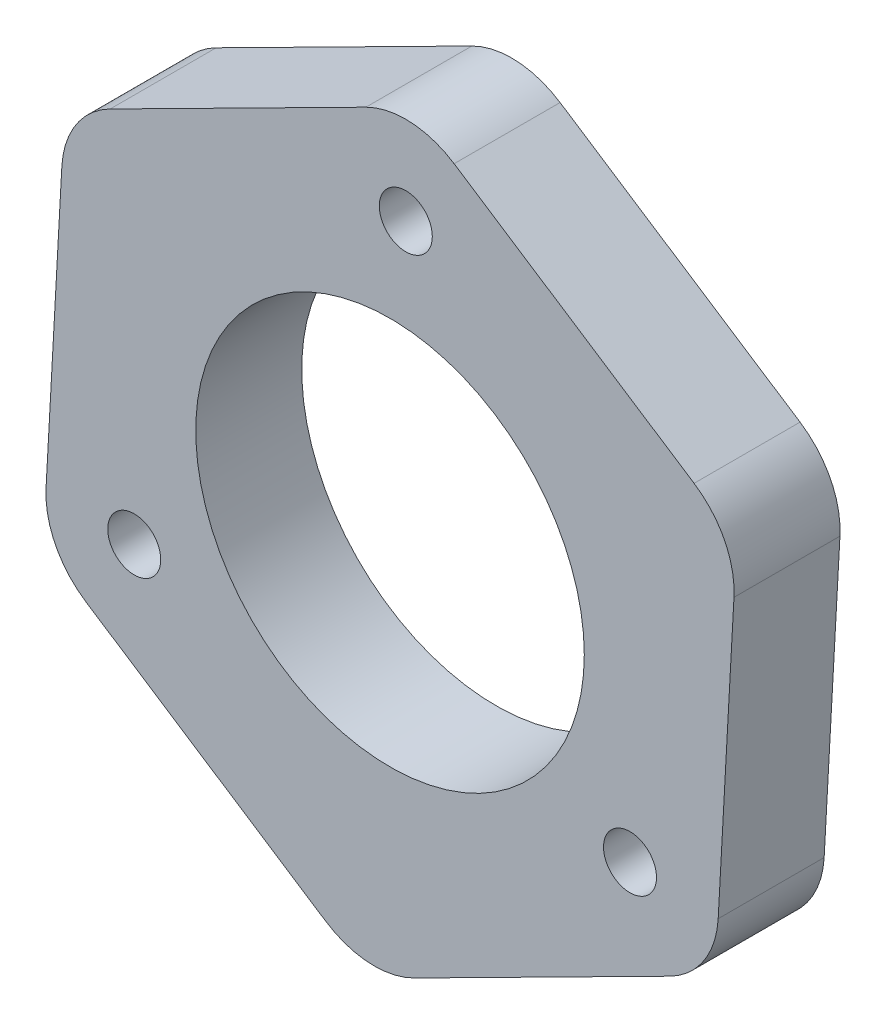
ISO-10303-21;
HEADER;
FILE_DESCRIPTION(('STEP AP214'),'2;1');
FILE_NAME('part.step','',(''),(''),'','','');
FILE_SCHEMA(('AUTOMOTIVE_DESIGN { 1 0 10303 214 1 1 1 1 }'));
ENDSEC;
DATA;
#1=APPLICATION_CONTEXT('core data for automotive mechanical design processes');
#2=APPLICATION_PROTOCOL_DEFINITION('international standard','automotive_design',2000,#1);
#3=PRODUCT_CONTEXT('',#1,'mechanical');
#4=PRODUCT('Part','Part','',(#3));
#5=PRODUCT_RELATED_PRODUCT_CATEGORY('part','',(#4));
#6=PRODUCT_DEFINITION_FORMATION('','',#4);
#7=PRODUCT_DEFINITION_CONTEXT('part definition',#1,'design');
#8=PRODUCT_DEFINITION('design','',#6,#7);
#9=PRODUCT_DEFINITION_SHAPE('','',#8);
#10=(LENGTH_UNIT() NAMED_UNIT(*) SI_UNIT(.MILLI.,.METRE.));
#11=(NAMED_UNIT(*) PLANE_ANGLE_UNIT() SI_UNIT($,.RADIAN.));
#12=(NAMED_UNIT(*) SI_UNIT($,.STERADIAN.) SOLID_ANGLE_UNIT());
#13=UNCERTAINTY_MEASURE_WITH_UNIT(LENGTH_MEASURE(1.E-05),#10,'distance_accuracy_value','');
#14=(GEOMETRIC_REPRESENTATION_CONTEXT(3) GLOBAL_UNCERTAINTY_ASSIGNED_CONTEXT((#13)) GLOBAL_UNIT_ASSIGNED_CONTEXT((#10,
#11,#12)) REPRESENTATION_CONTEXT('',''));
#15=CARTESIAN_POINT('',(0.,0.,0.));
#16=DIRECTION('',(0.,0.,1.));
#17=DIRECTION('',(1.,0.,0.));
#18=AXIS2_PLACEMENT_3D('',#15,#16,#17);
#19=CARTESIAN_POINT('',(-161.837688070376,274.028117434167,6.));
#20=DIRECTION('',(0.,0.,1.));
#21=DIRECTION('',(1.,0.,0.));
#22=AXIS2_PLACEMENT_3D('',#19,#20,#21);
#23=PLANE('',#22);
#24=CARTESIAN_POINT('',(-175.424950493414,282.905008773344,6.));
#25=DIRECTION('',(0.,0.,1.));
#26=DIRECTION('',(1.,0.,0.));
#27=AXIS2_PLACEMENT_3D('',#24,#25,#26);
#28=CIRCLE('',#27,1.50000000000685);
#29=CARTESIAN_POINT('',(-173.924950493408,282.905008773344,6.));
#30=VERTEX_POINT('',#29);
#31=EDGE_CURVE('E299',#30,#30,#28,.T.);
#32=ORIENTED_EDGE('',*,*,#31,.F.);
#33=EDGE_LOOP('',(#32));
#34=FACE_BOUND('',#33,.T.);
#35=CARTESIAN_POINT('',(-147.356435924949,281.356571316168,6.));
#36=DIRECTION('',(0.,0.,1.));
#37=DIRECTION('',(1.,0.,0.));
#38=AXIS2_PLACEMENT_3D('',#35,#36,#37);
#39=CIRCLE('',#38,1.50000000000002);
#40=CARTESIAN_POINT('',(-145.856435924949,281.356571316168,6.));
#41=VERTEX_POINT('',#40);
#42=EDGE_CURVE('E166',#41,#41,#39,.T.);
#43=ORIENTED_EDGE('',*,*,#42,.F.);
#44=EDGE_LOOP('',(#43));
#45=FACE_BOUND('',#44,.T.);
#46=CARTESIAN_POINT('',(-161.837688070376,274.028117434167,6.));
#47=DIRECTION('',(0.,0.,1.));
#48=DIRECTION('',(1.,0.,0.));
#49=AXIS2_PLACEMENT_3D('',#46,#47,#48);
#50=CIRCLE('',#49,5.00108120456059);
#51=CARTESIAN_POINT('',(-164.57299787921,269.841365296255,6.));
#52=VERTEX_POINT('',#51);
#53=CARTESIAN_POINT('',(-159.579510726105,269.565892843626,6.));
#54=VERTEX_POINT('',#53);
#55=EDGE_CURVE('E185',#52,#54,#50,.T.);
#56=ORIENTED_EDGE('',*,*,#55,.T.);
#57=DIRECTION('',(0.892251976726931,0.451537827902474,0.));
#58=VECTOR('',#57,1.);
#59=CARTESIAN_POINT('',(-159.579510726105,269.565892843626,6.));
#60=LINE('',#59,#58);
#61=CARTESIAN_POINT('',(-145.098261143827,276.894351790483,6.));
#62=VERTEX_POINT('',#61);
#63=EDGE_CURVE('E113',#54,#62,#60,.T.);
#64=ORIENTED_EDGE('',*,*,#63,.T.);
#65=CARTESIAN_POINT('',(-147.356435924949,281.356571316168,6.));
#66=DIRECTION('',(0.,0.,1.));
#67=DIRECTION('',(1.,0.,0.));
#68=AXIS2_PLACEMENT_3D('',#65,#66,#67);
#69=CIRCLE('',#68,5.00107552807402);
#70=CARTESIAN_POINT('',(-142.362953067882,281.081098279963,6.));
#71=VERTEX_POINT('',#70);
#72=EDGE_CURVE('E212',#62,#71,#69,.T.);
#73=ORIENTED_EDGE('',*,*,#72,.T.);
#74=DIRECTION('',(0.0550827586302694,0.998481792373642,0.));
#75=VECTOR('',#74,1.);
#76=CARTESIAN_POINT('',(-142.362953067882,281.081098279963,6.));
#77=LINE('',#76,#75);
#78=CARTESIAN_POINT('',(-141.468959895313,297.286457770187,6.));
#79=VERTEX_POINT('',#78);
#80=EDGE_CURVE('E231',#71,#79,#77,.T.);
#81=ORIENTED_EDGE('',*,*,#80,.T.);
#82=CARTESIAN_POINT('',(-146.46244275238,297.561930806392,6.));
#83=DIRECTION('',(0.,0.,1.));
#84=DIRECTION('',(1.,0.,0.));
#85=AXIS2_PLACEMENT_3D('',#82,#83,#84);
#86=CIRCLE('',#85,5.00107552807401);
#87=CARTESIAN_POINT('',(-143.727138152269,301.74867956672,6.));
#88=VERTEX_POINT('',#87);
#89=EDGE_CURVE('E228',#79,#88,#86,.T.);
#90=ORIENTED_EDGE('',*,*,#89,.T.);
#91=DIRECTION('',(-0.837169672168657,0.546943269453993,0.));
#92=VECTOR('',#91,1.);
#93=CARTESIAN_POINT('',(-143.727138152269,301.74867956672,6.));
#94=LINE('',#93,#92);
#95=CARTESIAN_POINT('',(-157.314401931566,310.625568829959,6.));
#96=VERTEX_POINT('',#95);
#97=EDGE_CURVE('E230',#88,#96,#94,.T.);
#98=ORIENTED_EDGE('',*,*,#97,.T.);
#99=CARTESIAN_POINT('',(-160.049709636379,306.438815317471,6.));
#100=DIRECTION('',(0.,0.,1.));
#101=DIRECTION('',(1.,0.,0.));
#102=AXIS2_PLACEMENT_3D('',#99,#100,#101);
#103=CIRCLE('',#102,5.00108120453343);
#104=CARTESIAN_POINT('',(-162.307885518535,310.901040647906,6.));
#105=VERTEX_POINT('',#104);
#106=EDGE_CURVE('E233',#96,#105,#103,.T.);
#107=ORIENTED_EDGE('',*,*,#106,.T.);
#108=DIRECTION('',(-0.892252124678746,-0.451537535545234,0.));
#109=VECTOR('',#108,1.);
#110=CARTESIAN_POINT('',(-162.307885518535,310.901040647906,6.));
#111=LINE('',#110,#109);
#112=CARTESIAN_POINT('',(-176.789137502071,303.572586446007,6.));
#113=VERTEX_POINT('',#112);
#114=EDGE_CURVE('E239',#105,#113,#111,.T.);
#115=ORIENTED_EDGE('',*,*,#114,.T.);
#116=CARTESIAN_POINT('',(-174.530965464621,299.110368712829,6.));
#117=DIRECTION('',(0.,0.,1.));
#118=DIRECTION('',(-1.,0.,0.));
#119=AXIS2_PLACEMENT_3D('',#116,#117,#118);
#120=CIRCLE('',#119,5.00107268983462);
#121=CARTESIAN_POINT('',(-179.524445578019,299.385839956532,6.));
#122=VERTEX_POINT('',#121);
#123=EDGE_CURVE('E144',#113,#122,#120,.T.);
#124=ORIENTED_EDGE('',*,*,#123,.T.);
#125=DIRECTION('',(-0.0550824314675046,-0.998481810422017,0.));
#126=VECTOR('',#125,1.);
#127=CARTESIAN_POINT('',(-179.524445578019,299.385839956532,6.));
#128=LINE('',#127,#126);
#129=CARTESIAN_POINT('',(-180.418433440736,283.180480173382,6.));
#130=VERTEX_POINT('',#129);
#131=EDGE_CURVE('E138',#122,#130,#128,.T.);
#132=ORIENTED_EDGE('',*,*,#131,.T.);
#133=CARTESIAN_POINT('',(-175.424950493414,282.905008773344,6.));
#134=DIRECTION('',(0.,0.,1.));
#135=DIRECTION('',(-1.,0.,0.));
#136=AXIS2_PLACEMENT_3D('',#133,#134,#135);
#137=CIRCLE('',#136,5.00107552806746);
#138=CARTESIAN_POINT('',(-178.160257197525,278.718261387618,6.));
#139=VERTEX_POINT('',#138);
#140=EDGE_CURVE('E142',#130,#139,#137,.T.);
#141=ORIENTED_EDGE('',*,*,#140,.T.);
#142=DIRECTION('',(0.83716939730839,-0.546943690164085,0.));
#143=VECTOR('',#142,1.);
#144=CARTESIAN_POINT('',(-178.160257197525,278.718261387618,6.));
#145=LINE('',#144,#143);
#146=EDGE_CURVE('E58',#139,#52,#145,.T.);
#147=ORIENTED_EDGE('',*,*,#146,.T.);
#148=EDGE_LOOP('',(#56,#64,#73,#81,#90,#98,#107,#115,#124,#132,#141,#147));
#149=FACE_BOUND('',#148,.T.);
#150=CARTESIAN_POINT('',(-160.049709636379,306.438815317471,6.));
#151=DIRECTION('',(0.,0.,1.));
#152=DIRECTION('',(1.,0.,0.));
#153=AXIS2_PLACEMENT_3D('',#150,#151,#152);
#154=CIRCLE('',#153,1.49999999999943);
#155=CARTESIAN_POINT('',(-158.549709636379,306.438815317471,6.));
#156=VERTEX_POINT('',#155);
#157=EDGE_CURVE('E305',#156,#156,#154,.T.);
#158=ORIENTED_EDGE('',*,*,#157,.F.);
#159=EDGE_LOOP('',(#158));
#160=FACE_BOUND('',#159,.T.);
#161=CARTESIAN_POINT('',(-160.943697823517,290.23347216233,6.));
#162=DIRECTION('',(0.,0.,1.));
#163=DIRECTION('',(1.,0.,0.));
#164=AXIS2_PLACEMENT_3D('',#161,#162,#163);
#165=CIRCLE('',#164,11.);
#166=CARTESIAN_POINT('',(-149.943697823517,290.23347216233,6.));
#167=VERTEX_POINT('',#166);
#168=EDGE_CURVE('E290',#167,#167,#165,.T.);
#169=ORIENTED_EDGE('',*,*,#168,.F.);
#170=EDGE_LOOP('',(#169));
#171=FACE_BOUND('',#170,.T.);
#172=ADVANCED_FACE('F41',(#34,#45,#149,#160,#171),#23,.T.);
#173=CARTESIAN_POINT('',(-161.837688070376,274.028117434167,0.));
#174=DIRECTION('',(0.,0.,1.));
#175=DIRECTION('',(1.,0.,0.));
#176=AXIS2_PLACEMENT_3D('',#173,#174,#175);
#177=PLANE('',#176);
#178=CARTESIAN_POINT('',(-161.837688070376,274.028117434167,0.));
#179=DIRECTION('',(0.,0.,1.));
#180=DIRECTION('',(1.,0.,0.));
#181=AXIS2_PLACEMENT_3D('',#178,#179,#180);
#182=CIRCLE('',#181,5.00108120456059);
#183=CARTESIAN_POINT('',(-164.57299787921,269.841365296255,0.));
#184=VERTEX_POINT('',#183);
#185=CARTESIAN_POINT('',(-159.579510726105,269.565892843626,0.));
#186=VERTEX_POINT('',#185);
#187=EDGE_CURVE('E162',#184,#186,#182,.T.);
#188=ORIENTED_EDGE('',*,*,#187,.F.);
#189=DIRECTION('',(0.83716939730839,-0.546943690164085,0.));
#190=VECTOR('',#189,1.);
#191=CARTESIAN_POINT('',(-178.160257197525,278.718261387618,0.));
#192=LINE('',#191,#190);
#193=CARTESIAN_POINT('',(-178.160257197525,278.718261387618,0.));
#194=VERTEX_POINT('',#193);
#195=EDGE_CURVE('E105',#194,#184,#192,.T.);
#196=ORIENTED_EDGE('',*,*,#195,.F.);
#197=CARTESIAN_POINT('',(-175.424950493414,282.905008773344,0.));
#198=DIRECTION('',(0.,0.,1.));
#199=DIRECTION('',(-1.,0.,0.));
#200=AXIS2_PLACEMENT_3D('',#197,#198,#199);
#201=CIRCLE('',#200,5.00107552806746);
#202=CARTESIAN_POINT('',(-180.418433440736,283.180480173382,0.));
#203=VERTEX_POINT('',#202);
#204=EDGE_CURVE('E99',#203,#194,#201,.T.);
#205=ORIENTED_EDGE('',*,*,#204,.F.);
#206=DIRECTION('',(-0.0550824314675046,-0.998481810422017,0.));
#207=VECTOR('',#206,1.);
#208=CARTESIAN_POINT('',(-179.524445578019,299.385839956532,0.));
#209=LINE('',#208,#207);
#210=CARTESIAN_POINT('',(-179.524445578019,299.385839956532,0.));
#211=VERTEX_POINT('',#210);
#212=EDGE_CURVE('E152',#211,#203,#209,.T.);
#213=ORIENTED_EDGE('',*,*,#212,.F.);
#214=CARTESIAN_POINT('',(-174.530965464621,299.110368712829,0.));
#215=DIRECTION('',(0.,0.,1.));
#216=DIRECTION('',(-1.,0.,0.));
#217=AXIS2_PLACEMENT_3D('',#214,#215,#216);
#218=CIRCLE('',#217,5.00107268983462);
#219=CARTESIAN_POINT('',(-176.789137502071,303.572586446007,0.));
#220=VERTEX_POINT('',#219);
#221=EDGE_CURVE('E180',#220,#211,#218,.T.);
#222=ORIENTED_EDGE('',*,*,#221,.F.);
#223=DIRECTION('',(-0.892252124678746,-0.451537535545234,0.));
#224=VECTOR('',#223,1.);
#225=CARTESIAN_POINT('',(-162.307885518535,310.901040647906,0.));
#226=LINE('',#225,#224);
#227=CARTESIAN_POINT('',(-162.307885518535,310.901040647906,0.));
#228=VERTEX_POINT('',#227);
#229=EDGE_CURVE('E178',#228,#220,#226,.T.);
#230=ORIENTED_EDGE('',*,*,#229,.F.);
#231=CARTESIAN_POINT('',(-160.049709636379,306.438815317471,0.));
#232=DIRECTION('',(0.,0.,1.));
#233=DIRECTION('',(1.,0.,0.));
#234=AXIS2_PLACEMENT_3D('',#231,#232,#233);
#235=CIRCLE('',#234,5.00108120453343);
#236=CARTESIAN_POINT('',(-157.314401931566,310.625568829959,0.));
#237=VERTEX_POINT('',#236);
#238=EDGE_CURVE('E176',#237,#228,#235,.T.);
#239=ORIENTED_EDGE('',*,*,#238,.F.);
#240=DIRECTION('',(-0.837169672168657,0.546943269453993,0.));
#241=VECTOR('',#240,1.);
#242=CARTESIAN_POINT('',(-143.727138152269,301.74867956672,0.));
#243=LINE('',#242,#241);
#244=CARTESIAN_POINT('',(-143.727138152269,301.74867956672,0.));
#245=VERTEX_POINT('',#244);
#246=EDGE_CURVE('E174',#245,#237,#243,.T.);
#247=ORIENTED_EDGE('',*,*,#246,.F.);
#248=CARTESIAN_POINT('',(-146.46244275238,297.561930806392,0.));
#249=DIRECTION('',(0.,0.,1.));
#250=DIRECTION('',(1.,0.,0.));
#251=AXIS2_PLACEMENT_3D('',#248,#249,#250);
#252=CIRCLE('',#251,5.00107552807401);
#253=CARTESIAN_POINT('',(-141.468959895313,297.286457770187,0.));
#254=VERTEX_POINT('',#253);
#255=EDGE_CURVE('E172',#254,#245,#252,.T.);
#256=ORIENTED_EDGE('',*,*,#255,.F.);
#257=DIRECTION('',(0.0550827586302694,0.998481792373642,0.));
#258=VECTOR('',#257,1.);
#259=CARTESIAN_POINT('',(-142.362953067882,281.081098279963,0.));
#260=LINE('',#259,#258);
#261=CARTESIAN_POINT('',(-142.362953067882,281.081098279963,0.));
#262=VERTEX_POINT('',#261);
#263=EDGE_CURVE('E170',#262,#254,#260,.T.);
#264=ORIENTED_EDGE('',*,*,#263,.F.);
#265=CARTESIAN_POINT('',(-147.356435924949,281.356571316168,0.));
#266=DIRECTION('',(0.,0.,1.));
#267=DIRECTION('',(1.,0.,0.));
#268=AXIS2_PLACEMENT_3D('',#265,#266,#267);
#269=CIRCLE('',#268,5.00107552807402);
#270=CARTESIAN_POINT('',(-145.098261143827,276.894351790483,0.));
#271=VERTEX_POINT('',#270);
#272=EDGE_CURVE('E168',#271,#262,#269,.T.);
#273=ORIENTED_EDGE('',*,*,#272,.F.);
#274=DIRECTION('',(0.892251976726931,0.451537827902474,0.));
#275=VECTOR('',#274,1.);
#276=CARTESIAN_POINT('',(-159.579510726105,269.565892843626,0.));
#277=LINE('',#276,#275);
#278=EDGE_CURVE('E165',#186,#271,#277,.T.);
#279=ORIENTED_EDGE('',*,*,#278,.F.);
#280=EDGE_LOOP('',(#188,#196,#205,#213,#222,#230,#239,#247,#256,#264,#273,#279));
#281=FACE_BOUND('',#280,.T.);
#282=CARTESIAN_POINT('',(-147.356435924949,281.356571316168,0.));
#283=DIRECTION('',(0.,0.,1.));
#284=DIRECTION('',(1.,0.,0.));
#285=AXIS2_PLACEMENT_3D('',#282,#283,#284);
#286=CIRCLE('',#285,1.50000000000002);
#287=CARTESIAN_POINT('',(-145.856435924949,281.356571316168,0.));
#288=VERTEX_POINT('',#287);
#289=EDGE_CURVE('E308',#288,#288,#286,.T.);
#290=ORIENTED_EDGE('',*,*,#289,.T.);
#291=EDGE_LOOP('',(#290));
#292=FACE_BOUND('',#291,.T.);
#293=CARTESIAN_POINT('',(-160.049709636379,306.438815317471,0.));
#294=DIRECTION('',(0.,0.,1.));
#295=DIRECTION('',(1.,0.,0.));
#296=AXIS2_PLACEMENT_3D('',#293,#294,#295);
#297=CIRCLE('',#296,1.49999999999943);
#298=CARTESIAN_POINT('',(-158.549709636379,306.438815317471,0.));
#299=VERTEX_POINT('',#298);
#300=EDGE_CURVE('E302',#299,#299,#297,.T.);
#301=ORIENTED_EDGE('',*,*,#300,.T.);
#302=EDGE_LOOP('',(#301));
#303=FACE_BOUND('',#302,.T.);
#304=CARTESIAN_POINT('',(-175.424950493414,282.905008773344,0.));
#305=DIRECTION('',(0.,0.,1.));
#306=DIRECTION('',(1.,0.,0.));
#307=AXIS2_PLACEMENT_3D('',#304,#305,#306);
#308=CIRCLE('',#307,1.50000000000685);
#309=CARTESIAN_POINT('',(-173.924950493408,282.905008773344,0.));
#310=VERTEX_POINT('',#309);
#311=EDGE_CURVE('E296',#310,#310,#308,.T.);
#312=ORIENTED_EDGE('',*,*,#311,.T.);
#313=EDGE_LOOP('',(#312));
#314=FACE_BOUND('',#313,.T.);
#315=CARTESIAN_POINT('',(-160.943697823517,290.23347216233,0.));
#316=DIRECTION('',(0.,0.,1.));
#317=DIRECTION('',(1.,0.,0.));
#318=AXIS2_PLACEMENT_3D('',#315,#316,#317);
#319=CIRCLE('',#318,11.);
#320=CARTESIAN_POINT('',(-149.943697823517,290.23347216233,0.));
#321=VERTEX_POINT('',#320);
#322=EDGE_CURVE('E293',#321,#321,#319,.T.);
#323=ORIENTED_EDGE('',*,*,#322,.T.);
#324=EDGE_LOOP('',(#323));
#325=FACE_BOUND('',#324,.T.);
#326=ADVANCED_FACE('F216',(#281,#292,#303,#314,#325),#177,.F.);
#327=CARTESIAN_POINT('',(-161.837688070376,274.028117434167,6.));
#328=DIRECTION('',(0.,0.,-1.));
#329=DIRECTION('',(-1.,0.,0.));
#330=AXIS2_PLACEMENT_3D('',#327,#328,#329);
#331=CYLINDRICAL_SURFACE('',#330,5.00108120456059);
#332=ORIENTED_EDGE('',*,*,#187,.T.);
#333=DIRECTION('',(0.,0.,-1.));
#334=VECTOR('',#333,1.);
#335=CARTESIAN_POINT('',(-159.579510726105,269.565892843626,6.));
#336=LINE('',#335,#334);
#337=EDGE_CURVE('E11',#54,#186,#336,.T.);
#338=ORIENTED_EDGE('',*,*,#337,.F.);
#339=ORIENTED_EDGE('',*,*,#55,.F.);
#340=DIRECTION('',(0.,0.,-1.));
#341=VECTOR('',#340,1.);
#342=CARTESIAN_POINT('',(-164.57299787921,269.841365296255,6.));
#343=LINE('',#342,#341);
#344=EDGE_CURVE('E158',#52,#184,#343,.T.);
#345=ORIENTED_EDGE('',*,*,#344,.T.);
#346=EDGE_LOOP('',(#332,#338,#339,#345));
#347=FACE_BOUND('',#346,.T.);
#348=ADVANCED_FACE('F43',(#347),#331,.T.);
#349=CARTESIAN_POINT('',(-159.579510726105,269.565892843626,6.));
#350=DIRECTION('',(-0.451537827902474,0.892251976726931,0.));
#351=DIRECTION('',(-0.892251976726931,-0.451537827902474,0.));
#352=AXIS2_PLACEMENT_3D('',#349,#350,#351);
#353=PLANE('',#352);
#354=ORIENTED_EDGE('',*,*,#278,.T.);
#355=DIRECTION('',(0.,0.,-1.));
#356=VECTOR('',#355,1.);
#357=CARTESIAN_POINT('',(-145.098261143827,276.894351790483,6.));
#358=LINE('',#357,#356);
#359=EDGE_CURVE('E50',#62,#271,#358,.T.);
#360=ORIENTED_EDGE('',*,*,#359,.F.);
#361=ORIENTED_EDGE('',*,*,#63,.F.);
#362=ORIENTED_EDGE('',*,*,#337,.T.);
#363=EDGE_LOOP('',(#354,#360,#361,#362));
#364=FACE_BOUND('',#363,.T.);
#365=ADVANCED_FACE('F428',(#364),#353,.F.);
#366=CARTESIAN_POINT('',(-147.356435924949,281.356571316168,6.));
#367=DIRECTION('',(0.,0.,-1.));
#368=DIRECTION('',(-1.,0.,0.));
#369=AXIS2_PLACEMENT_3D('',#366,#367,#368);
#370=CYLINDRICAL_SURFACE('',#369,5.00107552807402);
#371=ORIENTED_EDGE('',*,*,#272,.T.);
#372=DIRECTION('',(0.,0.,-1.));
#373=VECTOR('',#372,1.);
#374=CARTESIAN_POINT('',(-142.362953067882,281.081098279963,6.));
#375=LINE('',#374,#373);
#376=EDGE_CURVE('E204',#71,#262,#375,.T.);
#377=ORIENTED_EDGE('',*,*,#376,.F.);
#378=ORIENTED_EDGE('',*,*,#72,.F.);
#379=ORIENTED_EDGE('',*,*,#359,.T.);
#380=EDGE_LOOP('',(#371,#377,#378,#379));
#381=FACE_BOUND('',#380,.T.);
#382=ADVANCED_FACE('F210',(#381),#370,.T.);
#383=CARTESIAN_POINT('',(-142.362953067882,281.081098279963,6.));
#384=DIRECTION('',(-0.998481792373641,0.0550827586302694,0.));
#385=DIRECTION('',(-0.0550827586302694,-0.998481792373642,0.));
#386=AXIS2_PLACEMENT_3D('',#383,#384,#385);
#387=PLANE('',#386);
#388=ORIENTED_EDGE('',*,*,#263,.T.);
#389=DIRECTION('',(0.,0.,-1.));
#390=VECTOR('',#389,1.);
#391=CARTESIAN_POINT('',(-141.468959895313,297.286457770187,6.));
#392=LINE('',#391,#390);
#393=EDGE_CURVE('E201',#79,#254,#392,.T.);
#394=ORIENTED_EDGE('',*,*,#393,.F.);
#395=ORIENTED_EDGE('',*,*,#80,.F.);
#396=ORIENTED_EDGE('',*,*,#376,.T.);
#397=EDGE_LOOP('',(#388,#394,#395,#396));
#398=FACE_BOUND('',#397,.T.);
#399=ADVANCED_FACE('F222',(#398),#387,.F.);
#400=CARTESIAN_POINT('',(-146.46244275238,297.561930806392,6.));
#401=DIRECTION('',(0.,0.,-1.));
#402=DIRECTION('',(-1.,0.,0.));
#403=AXIS2_PLACEMENT_3D('',#400,#401,#402);
#404=CYLINDRICAL_SURFACE('',#403,5.00107552807401);
#405=ORIENTED_EDGE('',*,*,#255,.T.);
#406=DIRECTION('',(0.,0.,-1.));
#407=VECTOR('',#406,1.);
#408=CARTESIAN_POINT('',(-143.727138152269,301.74867956672,6.));
#409=LINE('',#408,#407);
#410=EDGE_CURVE('E198',#88,#245,#409,.T.);
#411=ORIENTED_EDGE('',*,*,#410,.F.);
#412=ORIENTED_EDGE('',*,*,#89,.F.);
#413=ORIENTED_EDGE('',*,*,#393,.T.);
#414=EDGE_LOOP('',(#405,#411,#412,#413));
#415=FACE_BOUND('',#414,.T.);
#416=ADVANCED_FACE('F226',(#415),#404,.T.);
#417=CARTESIAN_POINT('',(-143.727138152269,301.74867956672,6.));
#418=DIRECTION('',(-0.546943269453993,-0.837169672168657,0.));
#419=DIRECTION('',(0.837169672168657,-0.546943269453993,0.));
#420=AXIS2_PLACEMENT_3D('',#417,#418,#419);
#421=PLANE('',#420);
#422=ORIENTED_EDGE('',*,*,#246,.T.);
#423=DIRECTION('',(0.,0.,-1.));
#424=VECTOR('',#423,1.);
#425=CARTESIAN_POINT('',(-157.314401931566,310.625568829959,6.));
#426=LINE('',#425,#424);
#427=EDGE_CURVE('E195',#96,#237,#426,.T.);
#428=ORIENTED_EDGE('',*,*,#427,.F.);
#429=ORIENTED_EDGE('',*,*,#97,.F.);
#430=ORIENTED_EDGE('',*,*,#410,.T.);
#431=EDGE_LOOP('',(#422,#428,#429,#430));
#432=FACE_BOUND('',#431,.T.);
#433=ADVANCED_FACE('F389',(#432),#421,.F.);
#434=CARTESIAN_POINT('',(-160.049709636379,306.438815317471,6.));
#435=DIRECTION('',(0.,0.,-1.));
#436=DIRECTION('',(-1.,0.,0.));
#437=AXIS2_PLACEMENT_3D('',#434,#435,#436);
#438=CYLINDRICAL_SURFACE('',#437,5.00108120453343);
#439=ORIENTED_EDGE('',*,*,#238,.T.);
#440=DIRECTION('',(0.,0.,-1.));
#441=VECTOR('',#440,1.);
#442=CARTESIAN_POINT('',(-162.307885518535,310.901040647906,6.));
#443=LINE('',#442,#441);
#444=EDGE_CURVE('E192',#105,#228,#443,.T.);
#445=ORIENTED_EDGE('',*,*,#444,.F.);
#446=ORIENTED_EDGE('',*,*,#106,.F.);
#447=ORIENTED_EDGE('',*,*,#427,.T.);
#448=EDGE_LOOP('',(#439,#445,#446,#447));
#449=FACE_BOUND('',#448,.T.);
#450=ADVANCED_FACE('F379',(#449),#438,.T.);
#451=CARTESIAN_POINT('',(-162.307885518535,310.901040647906,6.));
#452=DIRECTION('',(0.451537535545234,-0.892252124678746,0.));
#453=DIRECTION('',(0.892252124678746,0.451537535545234,0.));
#454=AXIS2_PLACEMENT_3D('',#451,#452,#453);
#455=PLANE('',#454);
#456=ORIENTED_EDGE('',*,*,#229,.T.);
#457=DIRECTION('',(0.,0.,-1.));
#458=VECTOR('',#457,1.);
#459=CARTESIAN_POINT('',(-176.789137502071,303.572586446007,6.));
#460=LINE('',#459,#458);
#461=EDGE_CURVE('E189',#113,#220,#460,.T.);
#462=ORIENTED_EDGE('',*,*,#461,.F.);
#463=ORIENTED_EDGE('',*,*,#114,.F.);
#464=ORIENTED_EDGE('',*,*,#444,.T.);
#465=EDGE_LOOP('',(#456,#462,#463,#464));
#466=FACE_BOUND('',#465,.T.);
#467=ADVANCED_FACE('F245',(#466),#455,.F.);
#468=CARTESIAN_POINT('',(-174.530965464621,299.110368712829,6.));
#469=DIRECTION('',(0.,0.,-1.));
#470=DIRECTION('',(-1.,0.,0.));
#471=AXIS2_PLACEMENT_3D('',#468,#469,#470);
#472=CYLINDRICAL_SURFACE('',#471,5.00107268983462);
#473=ORIENTED_EDGE('',*,*,#221,.T.);
#474=DIRECTION('',(0.,0.,-1.));
#475=VECTOR('',#474,1.);
#476=CARTESIAN_POINT('',(-179.524445578019,299.385839956532,6.));
#477=LINE('',#476,#475);
#478=EDGE_CURVE('E153',#122,#211,#477,.T.);
#479=ORIENTED_EDGE('',*,*,#478,.F.);
#480=ORIENTED_EDGE('',*,*,#123,.F.);
#481=ORIENTED_EDGE('',*,*,#461,.T.);
#482=EDGE_LOOP('',(#473,#479,#480,#481));
#483=FACE_BOUND('',#482,.T.);
#484=ADVANCED_FACE('F249',(#483),#472,.T.);
#485=CARTESIAN_POINT('',(-179.524445578019,299.385839956532,6.));
#486=DIRECTION('',(0.998481810422016,-0.0550824314675046,0.));
#487=DIRECTION('',(0.0550824314675046,0.998481810422016,0.));
#488=AXIS2_PLACEMENT_3D('',#485,#486,#487);
#489=PLANE('',#488);
#490=ORIENTED_EDGE('',*,*,#212,.T.);
#491=DIRECTION('',(0.,0.,-1.));
#492=VECTOR('',#491,1.);
#493=CARTESIAN_POINT('',(-180.418433440736,283.180480173382,6.));
#494=LINE('',#493,#492);
#495=EDGE_CURVE('E149',#130,#203,#494,.T.);
#496=ORIENTED_EDGE('',*,*,#495,.F.);
#497=ORIENTED_EDGE('',*,*,#131,.F.);
#498=ORIENTED_EDGE('',*,*,#478,.T.);
#499=EDGE_LOOP('',(#490,#496,#497,#498));
#500=FACE_BOUND('',#499,.T.);
#501=ADVANCED_FACE('F150',(#500),#489,.F.);
#502=CARTESIAN_POINT('',(-175.424950493414,282.905008773344,6.));
#503=DIRECTION('',(0.,0.,-1.));
#504=DIRECTION('',(-1.,0.,0.));
#505=AXIS2_PLACEMENT_3D('',#502,#503,#504);
#506=CYLINDRICAL_SURFACE('',#505,5.00107552806746);
#507=ORIENTED_EDGE('',*,*,#204,.T.);
#508=DIRECTION('',(0.,0.,-1.));
#509=VECTOR('',#508,1.);
#510=CARTESIAN_POINT('',(-178.160257197525,278.718261387618,6.));
#511=LINE('',#510,#509);
#512=EDGE_CURVE('E154',#139,#194,#511,.T.);
#513=ORIENTED_EDGE('',*,*,#512,.F.);
#514=ORIENTED_EDGE('',*,*,#140,.F.);
#515=ORIENTED_EDGE('',*,*,#495,.T.);
#516=EDGE_LOOP('',(#507,#513,#514,#515));
#517=FACE_BOUND('',#516,.T.);
#518=ADVANCED_FACE('F156',(#517),#506,.T.);
#519=CARTESIAN_POINT('',(-178.160257197525,278.718261387618,6.));
#520=DIRECTION('',(0.546943690164086,0.83716939730839,0.));
#521=DIRECTION('',(-0.83716939730839,0.546943690164086,0.));
#522=AXIS2_PLACEMENT_3D('',#519,#520,#521);
#523=PLANE('',#522);
#524=ORIENTED_EDGE('',*,*,#195,.T.);
#525=ORIENTED_EDGE('',*,*,#344,.F.);
#526=ORIENTED_EDGE('',*,*,#146,.F.);
#527=ORIENTED_EDGE('',*,*,#512,.T.);
#528=EDGE_LOOP('',(#524,#525,#526,#527));
#529=FACE_BOUND('',#528,.T.);
#530=ADVANCED_FACE('F253',(#529),#523,.F.);
#531=CARTESIAN_POINT('',(-147.356435924949,281.356571316168,6.));
#532=DIRECTION('',(0.,0.,-1.));
#533=DIRECTION('',(-1.,0.,0.));
#534=AXIS2_PLACEMENT_3D('',#531,#532,#533);
#535=CYLINDRICAL_SURFACE('',#534,1.50000000000002);
#536=ORIENTED_EDGE('',*,*,#42,.T.);
#537=EDGE_LOOP('',(#536));
#538=FACE_BOUND('',#537,.T.);
#539=ORIENTED_EDGE('',*,*,#289,.F.);
#540=EDGE_LOOP('',(#539));
#541=FACE_BOUND('',#540,.T.);
#542=ADVANCED_FACE('F255',(#538,#541),#535,.F.);
#543=CARTESIAN_POINT('',(-160.049709636379,306.438815317471,6.));
#544=DIRECTION('',(0.,0.,-1.));
#545=DIRECTION('',(-1.,0.,0.));
#546=AXIS2_PLACEMENT_3D('',#543,#544,#545);
#547=CYLINDRICAL_SURFACE('',#546,1.49999999999943);
#548=ORIENTED_EDGE('',*,*,#157,.T.);
#549=EDGE_LOOP('',(#548));
#550=FACE_BOUND('',#549,.T.);
#551=ORIENTED_EDGE('',*,*,#300,.F.);
#552=EDGE_LOOP('',(#551));
#553=FACE_BOUND('',#552,.T.);
#554=ADVANCED_FACE('F261',(#550,#553),#547,.F.);
#555=CARTESIAN_POINT('',(-175.424950493414,282.905008773344,6.));
#556=DIRECTION('',(0.,0.,-1.));
#557=DIRECTION('',(-1.,0.,0.));
#558=AXIS2_PLACEMENT_3D('',#555,#556,#557);
#559=CYLINDRICAL_SURFACE('',#558,1.50000000000685);
#560=ORIENTED_EDGE('',*,*,#31,.T.);
#561=EDGE_LOOP('',(#560));
#562=FACE_BOUND('',#561,.T.);
#563=ORIENTED_EDGE('',*,*,#311,.F.);
#564=EDGE_LOOP('',(#563));
#565=FACE_BOUND('',#564,.T.);
#566=ADVANCED_FACE('F277',(#562,#565),#559,.F.);
#567=CARTESIAN_POINT('',(-160.943697823517,290.23347216233,6.));
#568=DIRECTION('',(0.,0.,-1.));
#569=DIRECTION('',(-1.,0.,0.));
#570=AXIS2_PLACEMENT_3D('',#567,#568,#569);
#571=CYLINDRICAL_SURFACE('',#570,11.);
#572=ORIENTED_EDGE('',*,*,#168,.T.);
#573=EDGE_LOOP('',(#572));
#574=FACE_BOUND('',#573,.T.);
#575=ORIENTED_EDGE('',*,*,#322,.F.);
#576=EDGE_LOOP('',(#575));
#577=FACE_BOUND('',#576,.T.);
#578=ADVANCED_FACE('F281',(#574,#577),#571,.F.);
#579=CLOSED_SHELL('',(#172,#326,#348,#365,#382,#399,#416,#433,#450,#467,#484,#501,#518,#530,
#542,#554,#566,#578));
#580=MANIFOLD_SOLID_BREP('B2',#579);
#581=ADVANCED_BREP_SHAPE_REPRESENTATION('',(#18,#580),#14);
#582=SHAPE_DEFINITION_REPRESENTATION(#9,#581);
ENDSEC;
END-ISO-10303-21;
